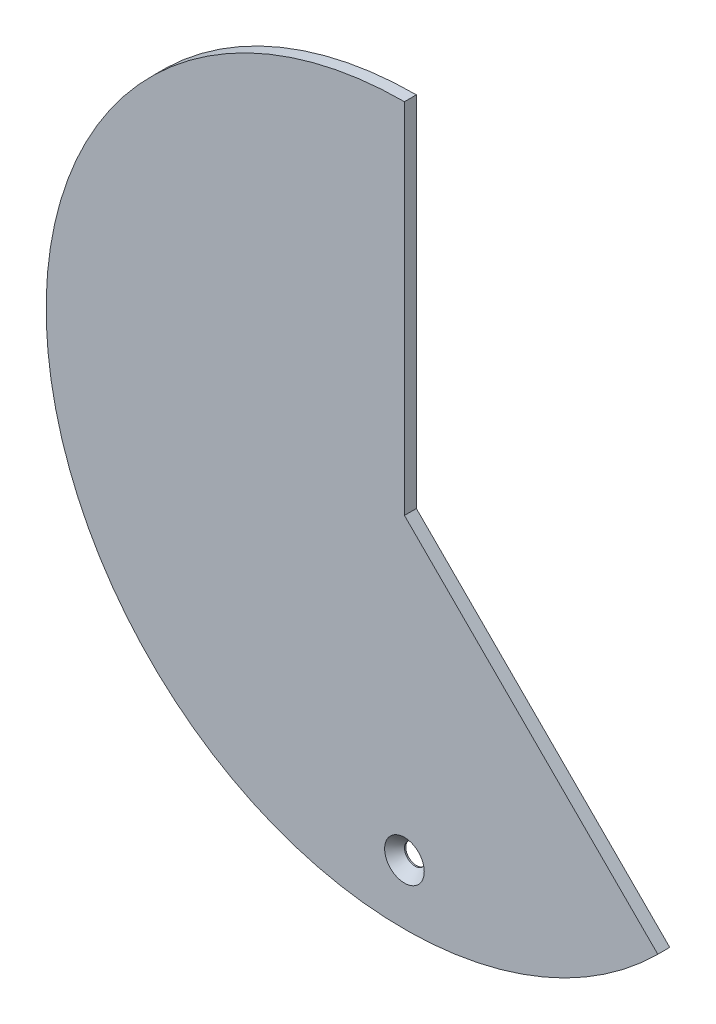
ISO-10303-21;
HEADER;
FILE_DESCRIPTION(('STEP AP214'),'2;1');
FILE_NAME('part.step','',(''),(''),'','','');
FILE_SCHEMA(('AUTOMOTIVE_DESIGN { 1 0 10303 214 1 1 1 1 }'));
ENDSEC;
DATA;
#1=APPLICATION_CONTEXT('core data for automotive mechanical design processes');
#2=APPLICATION_PROTOCOL_DEFINITION('international standard','automotive_design',2000,#1);
#3=PRODUCT_CONTEXT('',#1,'mechanical');
#4=PRODUCT('Part','Part','',(#3));
#5=PRODUCT_RELATED_PRODUCT_CATEGORY('part','',(#4));
#6=PRODUCT_DEFINITION_FORMATION('','',#4);
#7=PRODUCT_DEFINITION_CONTEXT('part definition',#1,'design');
#8=PRODUCT_DEFINITION('design','',#6,#7);
#9=PRODUCT_DEFINITION_SHAPE('','',#8);
#10=(LENGTH_UNIT() NAMED_UNIT(*) SI_UNIT(.MILLI.,.METRE.));
#11=(NAMED_UNIT(*) PLANE_ANGLE_UNIT() SI_UNIT($,.RADIAN.));
#12=(NAMED_UNIT(*) SI_UNIT($,.STERADIAN.) SOLID_ANGLE_UNIT());
#13=UNCERTAINTY_MEASURE_WITH_UNIT(LENGTH_MEASURE(1.E-05),#10,'distance_accuracy_value','');
#14=(GEOMETRIC_REPRESENTATION_CONTEXT(3) GLOBAL_UNCERTAINTY_ASSIGNED_CONTEXT((#13)) GLOBAL_UNIT_ASSIGNED_CONTEXT((#10,
#11,#12)) REPRESENTATION_CONTEXT('',''));
#15=CARTESIAN_POINT('',(0.,0.,0.));
#16=DIRECTION('',(0.,0.,1.));
#17=DIRECTION('',(1.,0.,0.));
#18=AXIS2_PLACEMENT_3D('',#15,#16,#17);
#19=CARTESIAN_POINT('',(0.,0.,2.54));
#20=DIRECTION('',(-1.,0.,0.));
#21=DIRECTION('',(0.,0.,1.));
#22=AXIS2_PLACEMENT_3D('',#19,#20,#21);
#23=PLANE('',#22);
#24=DIRECTION('',(0.,1.,0.));
#25=VECTOR('',#24,1.);
#26=CARTESIAN_POINT('',(0.,0.,0.));
#27=LINE('',#26,#25);
#28=CARTESIAN_POINT('',(0.,0.,0.));
#29=VERTEX_POINT('',#28);
#30=CARTESIAN_POINT('',(0.,76.2,0.));
#31=VERTEX_POINT('',#30);
#32=EDGE_CURVE('E81',#29,#31,#27,.T.);
#33=ORIENTED_EDGE('',*,*,#32,.T.);
#34=DIRECTION('',(0.,0.,-1.));
#35=VECTOR('',#34,1.);
#36=CARTESIAN_POINT('',(0.,76.2,2.54));
#37=LINE('',#36,#35);
#38=CARTESIAN_POINT('',(0.,76.2,2.54));
#39=VERTEX_POINT('',#38);
#40=EDGE_CURVE('E11',#39,#31,#37,.T.);
#41=ORIENTED_EDGE('',*,*,#40,.F.);
#42=DIRECTION('',(0.,1.,0.));
#43=VECTOR('',#42,1.);
#44=CARTESIAN_POINT('',(0.,0.,2.54));
#45=LINE('',#44,#43);
#46=CARTESIAN_POINT('',(0.,0.,2.54));
#47=VERTEX_POINT('',#46);
#48=EDGE_CURVE('E74',#47,#39,#45,.T.);
#49=ORIENTED_EDGE('',*,*,#48,.F.);
#50=DIRECTION('',(0.,0.,-1.));
#51=VECTOR('',#50,1.);
#52=CARTESIAN_POINT('',(0.,0.,2.54));
#53=LINE('',#52,#51);
#54=EDGE_CURVE('E82',#47,#29,#53,.T.);
#55=ORIENTED_EDGE('',*,*,#54,.T.);
#56=EDGE_LOOP('',(#33,#41,#49,#55));
#57=FACE_BOUND('',#56,.T.);
#58=ADVANCED_FACE('F34',(#57),#23,.F.);
#59=CARTESIAN_POINT('',(0.,0.,2.54));
#60=DIRECTION('',(0.,0.,-1.));
#61=DIRECTION('',(-1.,0.,0.));
#62=AXIS2_PLACEMENT_3D('',#59,#60,#61);
#63=CYLINDRICAL_SURFACE('',#62,76.2);
#64=CARTESIAN_POINT('',(0.,0.,0.));
#65=DIRECTION('',(0.,0.,1.));
#66=DIRECTION('',(1.,0.,0.));
#67=AXIS2_PLACEMENT_3D('',#64,#65,#66);
#68=CIRCLE('',#67,76.2);
#69=CARTESIAN_POINT('',(53.8815367264146,-53.8815367264152,0.));
#70=VERTEX_POINT('',#69);
#71=EDGE_CURVE('E62',#31,#70,#68,.T.);
#72=ORIENTED_EDGE('',*,*,#71,.T.);
#73=DIRECTION('',(0.,0.,-1.));
#74=VECTOR('',#73,1.);
#75=CARTESIAN_POINT('',(53.8815367264146,-53.8815367264152,2.54));
#76=LINE('',#75,#74);
#77=CARTESIAN_POINT('',(53.8815367264146,-53.8815367264152,2.54));
#78=VERTEX_POINT('',#77);
#79=EDGE_CURVE('E42',#78,#70,#76,.T.);
#80=ORIENTED_EDGE('',*,*,#79,.F.);
#81=CARTESIAN_POINT('',(0.,0.,2.54));
#82=DIRECTION('',(0.,0.,1.));
#83=DIRECTION('',(1.,0.,0.));
#84=AXIS2_PLACEMENT_3D('',#81,#82,#83);
#85=CIRCLE('',#84,76.2);
#86=EDGE_CURVE('E70',#39,#78,#85,.T.);
#87=ORIENTED_EDGE('',*,*,#86,.F.);
#88=ORIENTED_EDGE('',*,*,#40,.T.);
#89=EDGE_LOOP('',(#72,#80,#87,#88));
#90=FACE_BOUND('',#89,.T.);
#91=ADVANCED_FACE('F71',(#90),#63,.T.);
#92=CARTESIAN_POINT('',(0.,0.,2.54));
#93=DIRECTION('',(-0.707106781186551,-0.707106781186544,0.));
#94=DIRECTION('',(0.707106781186544,-0.707106781186551,0.));
#95=AXIS2_PLACEMENT_3D('',#92,#93,#94);
#96=PLANE('',#95);
#97=DIRECTION('',(-0.707106781186544,0.707106781186551,0.));
#98=VECTOR('',#97,1.);
#99=CARTESIAN_POINT('',(0.,0.,0.));
#100=LINE('',#99,#98);
#101=EDGE_CURVE('E67',#70,#29,#100,.T.);
#102=ORIENTED_EDGE('',*,*,#101,.T.);
#103=ORIENTED_EDGE('',*,*,#54,.F.);
#104=DIRECTION('',(-0.707106781186544,0.707106781186551,0.));
#105=VECTOR('',#104,1.);
#106=CARTESIAN_POINT('',(0.,0.,2.54));
#107=LINE('',#106,#105);
#108=EDGE_CURVE('E50',#78,#47,#107,.T.);
#109=ORIENTED_EDGE('',*,*,#108,.F.);
#110=ORIENTED_EDGE('',*,*,#79,.T.);
#111=EDGE_LOOP('',(#102,#103,#109,#110));
#112=FACE_BOUND('',#111,.T.);
#113=ADVANCED_FACE('F93',(#112),#96,.F.);
#114=CARTESIAN_POINT('',(0.,0.,2.54));
#115=DIRECTION('',(0.,0.,1.));
#116=DIRECTION('',(1.,0.,0.));
#117=AXIS2_PLACEMENT_3D('',#114,#115,#116);
#118=PLANE('',#117);
#119=CARTESIAN_POINT('',(0.,-63.5,2.54));
#120=DIRECTION('',(0.,0.,1.));
#121=DIRECTION('',(1.,0.,0.));
#122=AXIS2_PLACEMENT_3D('',#119,#120,#121);
#123=CIRCLE('',#122,4.2164);
#124=CARTESIAN_POINT('',(4.21640000000001,-63.5,2.54));
#125=VERTEX_POINT('',#124);
#126=EDGE_CURVE('E150',#125,#125,#123,.T.);
#127=ORIENTED_EDGE('',*,*,#126,.F.);
#128=EDGE_LOOP('',(#127));
#129=FACE_BOUND('',#128,.T.);
#130=ORIENTED_EDGE('',*,*,#48,.T.);
#131=ORIENTED_EDGE('',*,*,#86,.T.);
#132=ORIENTED_EDGE('',*,*,#108,.T.);
#133=EDGE_LOOP('',(#130,#131,#132));
#134=FACE_BOUND('',#133,.T.);
#135=ADVANCED_FACE('F77',(#129,#134),#118,.T.);
#136=CARTESIAN_POINT('',(0.,0.,0.));
#137=DIRECTION('',(0.,0.,1.));
#138=DIRECTION('',(1.,0.,0.));
#139=AXIS2_PLACEMENT_3D('',#136,#137,#138);
#140=PLANE('',#139);
#141=CARTESIAN_POINT('',(0.,-63.5,0.));
#142=DIRECTION('',(0.,0.,1.));
#143=DIRECTION('',(1.,0.,0.));
#144=AXIS2_PLACEMENT_3D('',#141,#142,#143);
#145=CIRCLE('',#144,2.2479);
#146=CARTESIAN_POINT('',(2.24790000000001,-63.5,0.));
#147=VERTEX_POINT('',#146);
#148=EDGE_CURVE('E84',#147,#147,#145,.T.);
#149=ORIENTED_EDGE('',*,*,#148,.T.);
#150=EDGE_LOOP('',(#149));
#151=FACE_BOUND('',#150,.T.);
#152=ORIENTED_EDGE('',*,*,#32,.F.);
#153=ORIENTED_EDGE('',*,*,#101,.F.);
#154=ORIENTED_EDGE('',*,*,#71,.F.);
#155=EDGE_LOOP('',(#152,#153,#154));
#156=FACE_BOUND('',#155,.T.);
#157=ADVANCED_FACE('F94',(#151,#156),#140,.F.);
#158=CARTESIAN_POINT('',(0.,-63.5,2.54));
#159=DIRECTION('',(0.,0.,1.));
#160=DIRECTION('',(1.,0.,0.));
#161=AXIS2_PLACEMENT_3D('',#158,#159,#160);
#162=CYLINDRICAL_SURFACE('',#161,2.2479);
#163=ORIENTED_EDGE('',*,*,#148,.F.);
#164=EDGE_LOOP('',(#163));
#165=FACE_BOUND('',#164,.T.);
#166=CARTESIAN_POINT('',(0.,-63.5,0.275499790385436));
#167=DIRECTION('',(0.,0.,1.));
#168=DIRECTION('',(1.,0.,0.));
#169=AXIS2_PLACEMENT_3D('',#166,#167,#168);
#170=CIRCLE('',#169,2.2479);
#171=CARTESIAN_POINT('',(2.2479,-63.5,0.275499790385436));
#172=VERTEX_POINT('',#171);
#173=EDGE_CURVE('E88',#172,#172,#170,.T.);
#174=ORIENTED_EDGE('',*,*,#173,.T.);
#175=EDGE_LOOP('',(#174));
#176=FACE_BOUND('',#175,.T.);
#177=ADVANCED_FACE('F96',(#165,#176),#162,.F.);
#178=CARTESIAN_POINT('',(0.,-63.5,2.54));
#179=DIRECTION('',(0.,0.,1.));
#180=DIRECTION('',(1.,0.,0.));
#181=AXIS2_PLACEMENT_3D('',#178,#179,#180);
#182=CONICAL_SURFACE('',#181,4.2164,0.715584993317674);
#183=ORIENTED_EDGE('',*,*,#173,.F.);
#184=EDGE_LOOP('',(#183));
#185=FACE_BOUND('',#184,.T.);
#186=ORIENTED_EDGE('',*,*,#126,.T.);
#187=EDGE_LOOP('',(#186));
#188=FACE_BOUND('',#187,.T.);
#189=ADVANCED_FACE('F103',(#185,#188),#182,.F.);
#190=CLOSED_SHELL('',(#58,#91,#113,#135,#157,#177,#189));
#191=MANIFOLD_SOLID_BREP('B2',#190);
#192=ADVANCED_BREP_SHAPE_REPRESENTATION('',(#18,#191),#14);
#193=SHAPE_DEFINITION_REPRESENTATION(#9,#192);
ENDSEC;
END-ISO-10303-21;
